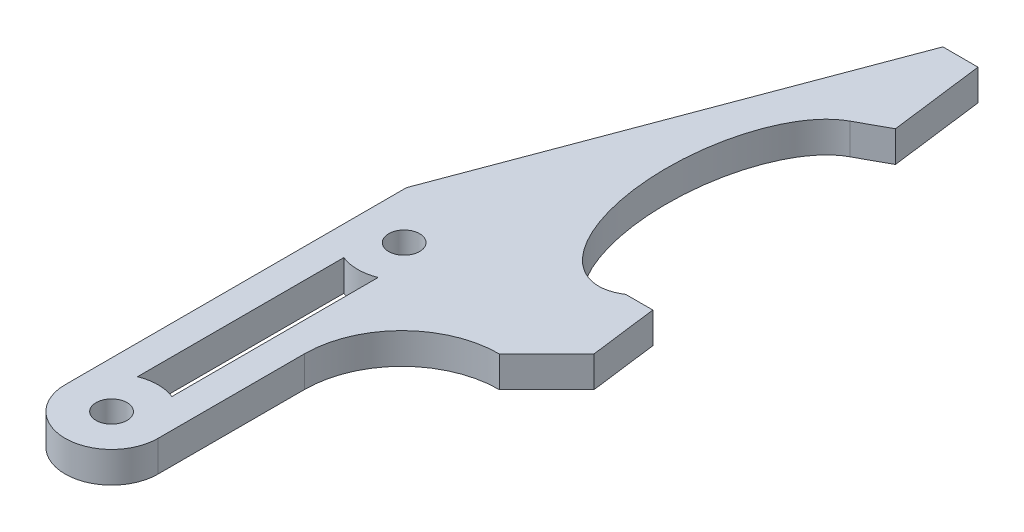
ISO-10303-21;
HEADER;
FILE_DESCRIPTION(('STEP AP214'),'2;1');
FILE_NAME('part.step','',(''),(''),'','','');
FILE_SCHEMA(('AUTOMOTIVE_DESIGN { 1 0 10303 214 1 1 1 1 }'));
ENDSEC;
DATA;
#1=APPLICATION_CONTEXT('core data for automotive mechanical design processes');
#2=APPLICATION_PROTOCOL_DEFINITION('international standard','automotive_design',2000,#1);
#3=PRODUCT_CONTEXT('',#1,'mechanical');
#4=PRODUCT('Part','Part','',(#3));
#5=PRODUCT_RELATED_PRODUCT_CATEGORY('part','',(#4));
#6=PRODUCT_DEFINITION_FORMATION('','',#4);
#7=PRODUCT_DEFINITION_CONTEXT('part definition',#1,'design');
#8=PRODUCT_DEFINITION('design','',#6,#7);
#9=PRODUCT_DEFINITION_SHAPE('','',#8);
#10=(LENGTH_UNIT() NAMED_UNIT(*) SI_UNIT(.MILLI.,.METRE.));
#11=(NAMED_UNIT(*) PLANE_ANGLE_UNIT() SI_UNIT($,.RADIAN.));
#12=(NAMED_UNIT(*) SI_UNIT($,.STERADIAN.) SOLID_ANGLE_UNIT());
#13=UNCERTAINTY_MEASURE_WITH_UNIT(LENGTH_MEASURE(1.E-05),#10,'distance_accuracy_value','');
#14=(GEOMETRIC_REPRESENTATION_CONTEXT(3) GLOBAL_UNCERTAINTY_ASSIGNED_CONTEXT((#13)) GLOBAL_UNIT_ASSIGNED_CONTEXT((#10,
#11,#12)) REPRESENTATION_CONTEXT('',''));
#15=CARTESIAN_POINT('',(0.,0.,0.));
#16=DIRECTION('',(0.,0.,1.));
#17=DIRECTION('',(1.,0.,0.));
#18=AXIS2_PLACEMENT_3D('',#15,#16,#17);
#19=CARTESIAN_POINT('',(12.5,0.,10.));
#20=DIRECTION('',(-0.991907308323476,0.,0.126964135465405));
#21=DIRECTION('',(0.126964135465405,0.,0.991907308323476));
#22=AXIS2_PLACEMENT_3D('',#19,#20,#21);
#23=PLANE('',#22);
#24=DIRECTION('',(0.126964135465405,0.,0.991907308323476));
#25=VECTOR('',#24,1.);
#26=CARTESIAN_POINT('',(12.5,0.,10.));
#27=LINE('',#26,#25);
#28=CARTESIAN_POINT('',(10.9945313979645,0.,-1.76147345340224));
#29=VERTEX_POINT('',#28);
#30=CARTESIAN_POINT('',(11.8787234042553,0.,5.14627659574474));
#31=VERTEX_POINT('',#30);
#32=EDGE_CURVE('E250',#29,#31,#27,.T.);
#33=ORIENTED_EDGE('',*,*,#32,.F.);
#34=DIRECTION('',(0.,1.,0.));
#35=VECTOR('',#34,1.);
#36=CARTESIAN_POINT('',(10.9945313979645,0.,-1.76147345340224));
#37=LINE('',#36,#35);
#38=CARTESIAN_POINT('',(10.9945313979645,3.175,-1.76147345340224));
#39=VERTEX_POINT('',#38);
#40=EDGE_CURVE('E152',#29,#39,#37,.T.);
#41=ORIENTED_EDGE('',*,*,#40,.T.);
#42=DIRECTION('',(0.126964135465405,0.,0.991907308323476));
#43=VECTOR('',#42,1.);
#44=CARTESIAN_POINT('',(12.5,3.175,10.));
#45=LINE('',#44,#43);
#46=CARTESIAN_POINT('',(11.8787234042553,3.175,5.14627659574474));
#47=VERTEX_POINT('',#46);
#48=EDGE_CURVE('E167',#39,#47,#45,.T.);
#49=ORIENTED_EDGE('',*,*,#48,.T.);
#50=DIRECTION('',(0.,1.,0.));
#51=VECTOR('',#50,1.);
#52=CARTESIAN_POINT('',(11.8787234042553,-6.825,5.14627659574474));
#53=LINE('',#52,#51);
#54=EDGE_CURVE('E252',#31,#47,#53,.T.);
#55=ORIENTED_EDGE('',*,*,#54,.F.);
#56=EDGE_LOOP('',(#33,#41,#49,#55));
#57=FACE_BOUND('',#56,.T.);
#58=ADVANCED_FACE('F35',(#57),#23,.F.);
#59=CARTESIAN_POINT('',(7.025,3.175,20.));
#60=DIRECTION('',(0.,-1.,0.));
#61=DIRECTION('',(0.,0.,-1.));
#62=AXIS2_PLACEMENT_3D('',#59,#60,#61);
#63=PLANE('',#62);
#64=CARTESIAN_POINT('',(-7.7375,3.175,35.));
#65=DIRECTION('',(0.,1.,0.));
#66=DIRECTION('',(0.,0.,1.));
#67=AXIS2_PLACEMENT_3D('',#64,#65,#66);
#68=CIRCLE('',#67,4.7625);
#69=CARTESIAN_POINT('',(-5.97499999999999,3.175,30.5756356388742));
#70=VERTEX_POINT('',#69);
#71=CARTESIAN_POINT('',(-9.5,3.175,30.5756356388742));
#72=VERTEX_POINT('',#71);
#73=EDGE_CURVE('E469',#70,#72,#68,.T.);
#74=ORIENTED_EDGE('',*,*,#73,.T.);
#75=DIRECTION('',(0.,0.,1.));
#76=VECTOR('',#75,1.);
#77=CARTESIAN_POINT('',(-9.5,3.175,0.));
#78=LINE('',#77,#76);
#79=CARTESIAN_POINT('',(-9.5,3.175,9.42705531363683));
#80=VERTEX_POINT('',#79);
#81=EDGE_CURVE('E483',#80,#72,#78,.T.);
#82=ORIENTED_EDGE('',*,*,#81,.F.);
#83=CARTESIAN_POINT('',(-7.7375,3.175,5.00000000000001));
#84=DIRECTION('',(0.,1.,0.));
#85=DIRECTION('',(0.,0.,1.));
#86=AXIS2_PLACEMENT_3D('',#83,#84,#85);
#87=CIRCLE('',#86,4.76499999999999);
#88=CARTESIAN_POINT('',(-5.97500000000001,3.175,9.42705531363683));
#89=VERTEX_POINT('',#88);
#90=EDGE_CURVE('E480',#80,#89,#87,.T.);
#91=ORIENTED_EDGE('',*,*,#90,.T.);
#92=DIRECTION('',(0.,0.,1.));
#93=VECTOR('',#92,1.);
#94=CARTESIAN_POINT('',(-5.975,3.175,0.));
#95=LINE('',#94,#93);
#96=EDGE_CURVE('E472',#89,#70,#95,.T.);
#97=ORIENTED_EDGE('',*,*,#96,.T.);
#98=EDGE_LOOP('',(#74,#82,#91,#97));
#99=FACE_BOUND('',#98,.T.);
#100=CARTESIAN_POINT('',(-7.7375,3.175,5.00000000000001));
#101=DIRECTION('',(0.,1.,0.));
#102=DIRECTION('',(0.,0.,1.));
#103=AXIS2_PLACEMENT_3D('',#100,#101,#102);
#104=CIRCLE('',#103,1.5875);
#105=CARTESIAN_POINT('',(-7.7375,3.175,6.58750000000001));
#106=VERTEX_POINT('',#105);
#107=EDGE_CURVE('E273',#106,#106,#104,.T.);
#108=ORIENTED_EDGE('',*,*,#107,.F.);
#109=EDGE_LOOP('',(#108));
#110=FACE_BOUND('',#109,.T.);
#111=CARTESIAN_POINT('',(-7.7375,3.175,35.));
#112=DIRECTION('',(0.,1.,0.));
#113=DIRECTION('',(0.,0.,1.));
#114=AXIS2_PLACEMENT_3D('',#111,#112,#113);
#115=CIRCLE('',#114,1.5875);
#116=CARTESIAN_POINT('',(-7.7375,3.175,36.5875));
#117=VERTEX_POINT('',#116);
#118=EDGE_CURVE('E267',#117,#117,#115,.T.);
#119=ORIENTED_EDGE('',*,*,#118,.F.);
#120=EDGE_LOOP('',(#119));
#121=FACE_BOUND('',#120,.T.);
#122=CARTESIAN_POINT('',(6.09633634533938,3.175,-15.0992522479477));
#123=DIRECTION('',(0.,1.,0.));
#124=DIRECTION('',(0.,0.,-1.));
#125=AXIS2_PLACEMENT_3D('',#122,#123,#124);
#126=ELLIPSE('',#125,14.,7.);
#127=CARTESIAN_POINT('',(4.32986705230956,3.175,-28.6461465395236));
#128=VERTEX_POINT('',#127);
#129=CARTESIAN_POINT('',(8.22375595767332,3.175,-1.76147345340224));
#130=VERTEX_POINT('',#129);
#131=EDGE_CURVE('E144',#128,#130,#126,.T.);
#132=ORIENTED_EDGE('',*,*,#131,.F.);
#133=DIRECTION('',(0.877309526004927,0.,-0.479924989535876));
#134=VECTOR('',#133,1.);
#135=CARTESIAN_POINT('',(7.34235478092335,3.175,-30.2941032740363));
#136=LINE('',#135,#134);
#137=CARTESIAN_POINT('',(7.34235478092335,3.175,-30.2941032740363));
#138=VERTEX_POINT('',#137);
#139=EDGE_CURVE('E11',#128,#138,#136,.T.);
#140=ORIENTED_EDGE('',*,*,#139,.T.);
#141=CARTESIAN_POINT('',(6.09999999999999,3.175,-40.));
#142=VERTEX_POINT('',#141);
#143=EDGE_CURVE('E256',#142,#138,#45,.T.);
#144=ORIENTED_EDGE('',*,*,#143,.F.);
#145=DIRECTION('',(-1.,0.,0.));
#146=VECTOR('',#145,1.);
#147=CARTESIAN_POINT('',(12.5,3.175,-40.));
#148=LINE('',#147,#146);
#149=CARTESIAN_POINT('',(2.49999999999999,3.175,-40.));
#150=VERTEX_POINT('',#149);
#151=EDGE_CURVE('E285',#142,#150,#148,.T.);
#152=ORIENTED_EDGE('',*,*,#151,.T.);
#153=DIRECTION('',(-0.351123441588392,0.,0.936329177569045));
#154=VECTOR('',#153,1.);
#155=CARTESIAN_POINT('',(2.49999999999999,3.175,-40.));
#156=LINE('',#155,#154);
#157=CARTESIAN_POINT('',(-12.5,3.175,0.));
#158=VERTEX_POINT('',#157);
#159=EDGE_CURVE('E287',#150,#158,#156,.T.);
#160=ORIENTED_EDGE('',*,*,#159,.T.);
#161=DIRECTION('',(0.,0.,1.));
#162=VECTOR('',#161,1.);
#163=CARTESIAN_POINT('',(-12.5,3.175,0.));
#164=LINE('',#163,#162);
#165=CARTESIAN_POINT('',(-12.5,3.175,35.));
#166=VERTEX_POINT('',#165);
#167=EDGE_CURVE('E289',#158,#166,#164,.T.);
#168=ORIENTED_EDGE('',*,*,#167,.T.);
#169=CARTESIAN_POINT('',(-7.7375,3.175,35.));
#170=DIRECTION('',(0.,1.,0.));
#171=DIRECTION('',(0.,0.,1.));
#172=AXIS2_PLACEMENT_3D('',#169,#170,#171);
#173=CIRCLE('',#172,4.76250000000001);
#174=CARTESIAN_POINT('',(-2.975,3.175,35.));
#175=VERTEX_POINT('',#174);
#176=EDGE_CURVE('E463',#166,#175,#173,.T.);
#177=ORIENTED_EDGE('',*,*,#176,.T.);
#178=DIRECTION('',(0.,0.,-1.));
#179=VECTOR('',#178,1.);
#180=CARTESIAN_POINT('',(-2.975,3.175,40.));
#181=LINE('',#180,#179);
#182=CARTESIAN_POINT('',(-2.975,3.175,20.));
#183=VERTEX_POINT('',#182);
#184=EDGE_CURVE('E279',#175,#183,#181,.T.);
#185=ORIENTED_EDGE('',*,*,#184,.T.);
#186=CARTESIAN_POINT('',(7.025,3.175,20.));
#187=DIRECTION('',(0.,-1.,0.));
#188=DIRECTION('',(0.,0.,-1.));
#189=AXIS2_PLACEMENT_3D('',#186,#187,#188);
#190=CIRCLE('',#189,10.);
#191=CARTESIAN_POINT('',(7.025,3.175,10.));
#192=VERTEX_POINT('',#191);
#193=EDGE_CURVE('E281',#183,#192,#190,.T.);
#194=ORIENTED_EDGE('',*,*,#193,.T.);
#195=DIRECTION('',(-0.707106781186551,0.,0.707106781186544));
#196=VECTOR('',#195,1.);
#197=CARTESIAN_POINT('',(7.025,3.175,10.));
#198=LINE('',#197,#196);
#199=EDGE_CURVE('E173',#47,#192,#198,.T.);
#200=ORIENTED_EDGE('',*,*,#199,.F.);
#201=ORIENTED_EDGE('',*,*,#48,.F.);
#202=DIRECTION('',(1.,0.,0.));
#203=VECTOR('',#202,1.);
#204=CARTESIAN_POINT('',(8.07701344455447,3.175,-1.76147345340224));
#205=LINE('',#204,#203);
#206=EDGE_CURVE('E157',#130,#39,#205,.T.);
#207=ORIENTED_EDGE('',*,*,#206,.F.);
#208=EDGE_LOOP('',(#132,#140,#144,#152,#160,#168,#177,#185,#194,#200,#201,#207));
#209=FACE_BOUND('',#208,.T.);
#210=ADVANCED_FACE('F165',(#99,#110,#121,#209),#63,.F.);
#211=CARTESIAN_POINT('',(7.025,0.,20.));
#212=DIRECTION('',(0.,-1.,0.));
#213=DIRECTION('',(0.,0.,-1.));
#214=AXIS2_PLACEMENT_3D('',#211,#212,#213);
#215=PLANE('',#214);
#216=CARTESIAN_POINT('',(6.09999999999999,0.,-40.));
#217=VERTEX_POINT('',#216);
#218=CARTESIAN_POINT('',(7.34235478092335,0.,-30.2941032740363));
#219=VERTEX_POINT('',#218);
#220=EDGE_CURVE('E255',#217,#219,#27,.T.);
#221=ORIENTED_EDGE('',*,*,#220,.T.);
#222=DIRECTION('',(-0.877309526004927,0.,0.479924989535876));
#223=VECTOR('',#222,1.);
#224=CARTESIAN_POINT('',(-14.0778726195254,0.,-18.5763433429094));
#225=LINE('',#224,#223);
#226=CARTESIAN_POINT('',(4.32986705230956,0.,-28.6461465395236));
#227=VERTEX_POINT('',#226);
#228=EDGE_CURVE('E57',#219,#227,#225,.T.);
#229=ORIENTED_EDGE('',*,*,#228,.T.);
#230=CARTESIAN_POINT('',(6.09633634533938,0.,-15.0992522479477));
#231=DIRECTION('',(0.,1.,0.));
#232=DIRECTION('',(0.,0.,-1.));
#233=AXIS2_PLACEMENT_3D('',#230,#231,#232);
#234=ELLIPSE('',#233,14.,7.);
#235=CARTESIAN_POINT('',(8.22375595767332,0.,-1.76147345340224));
#236=VERTEX_POINT('',#235);
#237=EDGE_CURVE('E151',#227,#236,#234,.T.);
#238=ORIENTED_EDGE('',*,*,#237,.T.);
#239=DIRECTION('',(1.,0.,0.));
#240=VECTOR('',#239,1.);
#241=CARTESIAN_POINT('',(8.07701344455447,0.,-1.76147345340224));
#242=LINE('',#241,#240);
#243=EDGE_CURVE('E160',#236,#29,#242,.T.);
#244=ORIENTED_EDGE('',*,*,#243,.T.);
#245=ORIENTED_EDGE('',*,*,#32,.T.);
#246=DIRECTION('',(0.707106781186551,0.,-0.707106781186544));
#247=VECTOR('',#246,1.);
#248=CARTESIAN_POINT('',(2.025,0.,15.));
#249=LINE('',#248,#247);
#250=CARTESIAN_POINT('',(7.025,0.,10.));
#251=VERTEX_POINT('',#250);
#252=EDGE_CURVE('E509',#251,#31,#249,.T.);
#253=ORIENTED_EDGE('',*,*,#252,.F.);
#254=CARTESIAN_POINT('',(7.025,0.,20.));
#255=DIRECTION('',(0.,-1.,0.));
#256=DIRECTION('',(0.,0.,-1.));
#257=AXIS2_PLACEMENT_3D('',#254,#255,#256);
#258=CIRCLE('',#257,10.);
#259=CARTESIAN_POINT('',(-2.975,0.,20.));
#260=VERTEX_POINT('',#259);
#261=EDGE_CURVE('E294',#260,#251,#258,.T.);
#262=ORIENTED_EDGE('',*,*,#261,.F.);
#263=DIRECTION('',(0.,0.,-1.));
#264=VECTOR('',#263,1.);
#265=CARTESIAN_POINT('',(-2.975,0.,40.));
#266=LINE('',#265,#264);
#267=CARTESIAN_POINT('',(-2.975,0.,35.));
#268=VERTEX_POINT('',#267);
#269=EDGE_CURVE('E276',#268,#260,#266,.T.);
#270=ORIENTED_EDGE('',*,*,#269,.F.);
#271=CARTESIAN_POINT('',(-7.7375,0.,35.));
#272=DIRECTION('',(0.,-1.,0.));
#273=DIRECTION('',(0.,0.,-1.));
#274=AXIS2_PLACEMENT_3D('',#271,#272,#273);
#275=CIRCLE('',#274,4.76250000000001);
#276=CARTESIAN_POINT('',(-12.5,0.,35.));
#277=VERTEX_POINT('',#276);
#278=EDGE_CURVE('E466',#268,#277,#275,.T.);
#279=ORIENTED_EDGE('',*,*,#278,.T.);
#280=DIRECTION('',(0.,0.,1.));
#281=VECTOR('',#280,1.);
#282=CARTESIAN_POINT('',(-12.5,0.,0.));
#283=LINE('',#282,#281);
#284=CARTESIAN_POINT('',(-12.5,0.,0.));
#285=VERTEX_POINT('',#284);
#286=EDGE_CURVE('E282',#285,#277,#283,.T.);
#287=ORIENTED_EDGE('',*,*,#286,.F.);
#288=DIRECTION('',(-0.351123441588392,0.,0.936329177569045));
#289=VECTOR('',#288,1.);
#290=CARTESIAN_POINT('',(2.49999999999999,0.,-40.));
#291=LINE('',#290,#289);
#292=CARTESIAN_POINT('',(2.49999999999999,0.,-40.));
#293=VERTEX_POINT('',#292);
#294=EDGE_CURVE('E299',#293,#285,#291,.T.);
#295=ORIENTED_EDGE('',*,*,#294,.F.);
#296=DIRECTION('',(-1.,0.,0.));
#297=VECTOR('',#296,1.);
#298=CARTESIAN_POINT('',(12.5,0.,-40.));
#299=LINE('',#298,#297);
#300=EDGE_CURVE('E297',#217,#293,#299,.T.);
#301=ORIENTED_EDGE('',*,*,#300,.F.);
#302=EDGE_LOOP('',(#221,#229,#238,#244,#245,#253,#262,#270,#279,#287,#295,#301));
#303=FACE_BOUND('',#302,.T.);
#304=DIRECTION('',(0.,0.,-1.));
#305=VECTOR('',#304,1.);
#306=CARTESIAN_POINT('',(-9.5,0.,20.));
#307=LINE('',#306,#305);
#308=CARTESIAN_POINT('',(-9.5,0.,30.5756356388742));
#309=VERTEX_POINT('',#308);
#310=CARTESIAN_POINT('',(-9.5,0.,9.42705531363683));
#311=VERTEX_POINT('',#310);
#312=EDGE_CURVE('E319',#309,#311,#307,.T.);
#313=ORIENTED_EDGE('',*,*,#312,.F.);
#314=CARTESIAN_POINT('',(-7.7375,0.,35.));
#315=DIRECTION('',(0.,-1.,0.));
#316=DIRECTION('',(0.,0.,-1.));
#317=AXIS2_PLACEMENT_3D('',#314,#315,#316);
#318=CIRCLE('',#317,4.7625);
#319=CARTESIAN_POINT('',(-5.97499999999999,0.,30.5756356388742));
#320=VERTEX_POINT('',#319);
#321=EDGE_CURVE('E321',#309,#320,#318,.T.);
#322=ORIENTED_EDGE('',*,*,#321,.T.);
#323=DIRECTION('',(0.,0.,-1.));
#324=VECTOR('',#323,1.);
#325=CARTESIAN_POINT('',(-5.97499999999999,0.,20.));
#326=LINE('',#325,#324);
#327=CARTESIAN_POINT('',(-5.975,0.,9.42705531363683));
#328=VERTEX_POINT('',#327);
#329=EDGE_CURVE('E313',#320,#328,#326,.T.);
#330=ORIENTED_EDGE('',*,*,#329,.T.);
#331=CARTESIAN_POINT('',(-7.7375,0.,5.00000000000001));
#332=DIRECTION('',(0.,-1.,0.));
#333=DIRECTION('',(0.,0.,-1.));
#334=AXIS2_PLACEMENT_3D('',#331,#332,#333);
#335=CIRCLE('',#334,4.76499999999999);
#336=EDGE_CURVE('E316',#328,#311,#335,.T.);
#337=ORIENTED_EDGE('',*,*,#336,.T.);
#338=EDGE_LOOP('',(#313,#322,#330,#337));
#339=FACE_BOUND('',#338,.T.);
#340=CARTESIAN_POINT('',(-7.7375,0.,5.00000000000001));
#341=DIRECTION('',(0.,1.,0.));
#342=DIRECTION('',(0.,0.,1.));
#343=AXIS2_PLACEMENT_3D('',#340,#341,#342);
#344=CIRCLE('',#343,1.5875);
#345=CARTESIAN_POINT('',(-7.7375,0.,6.58750000000001));
#346=VERTEX_POINT('',#345);
#347=EDGE_CURVE('E270',#346,#346,#344,.T.);
#348=ORIENTED_EDGE('',*,*,#347,.T.);
#349=EDGE_LOOP('',(#348));
#350=FACE_BOUND('',#349,.T.);
#351=CARTESIAN_POINT('',(-7.7375,0.,35.));
#352=DIRECTION('',(0.,1.,0.));
#353=DIRECTION('',(0.,0.,1.));
#354=AXIS2_PLACEMENT_3D('',#351,#352,#353);
#355=CIRCLE('',#354,1.5875);
#356=CARTESIAN_POINT('',(-7.7375,0.,36.5875));
#357=VERTEX_POINT('',#356);
#358=EDGE_CURVE('E266',#357,#357,#355,.T.);
#359=ORIENTED_EDGE('',*,*,#358,.T.);
#360=EDGE_LOOP('',(#359));
#361=FACE_BOUND('',#360,.T.);
#362=ADVANCED_FACE('F218',(#303,#339,#350,#361),#215,.T.);
#363=CARTESIAN_POINT('',(-2.975,3.175,40.));
#364=DIRECTION('',(-1.,0.,0.));
#365=DIRECTION('',(0.,0.,1.));
#366=AXIS2_PLACEMENT_3D('',#363,#364,#365);
#367=PLANE('',#366);
#368=DIRECTION('',(0.,1.,0.));
#369=VECTOR('',#368,1.);
#370=CARTESIAN_POINT('',(-2.975,-6.825,35.));
#371=LINE('',#370,#369);
#372=EDGE_CURVE('E474',#268,#175,#371,.T.);
#373=ORIENTED_EDGE('',*,*,#372,.F.);
#374=ORIENTED_EDGE('',*,*,#269,.T.);
#375=DIRECTION('',(0.,-1.,0.));
#376=VECTOR('',#375,1.);
#377=CARTESIAN_POINT('',(-2.975,3.175,20.));
#378=LINE('',#377,#376);
#379=EDGE_CURVE('E310',#183,#260,#378,.T.);
#380=ORIENTED_EDGE('',*,*,#379,.F.);
#381=ORIENTED_EDGE('',*,*,#184,.F.);
#382=EDGE_LOOP('',(#373,#374,#380,#381));
#383=FACE_BOUND('',#382,.T.);
#384=ADVANCED_FACE('F222',(#383),#367,.F.);
#385=CARTESIAN_POINT('',(7.025,3.175,20.));
#386=DIRECTION('',(0.,-1.,0.));
#387=DIRECTION('',(0.,0.,-1.));
#388=AXIS2_PLACEMENT_3D('',#385,#386,#387);
#389=CYLINDRICAL_SURFACE('',#388,10.);
#390=ORIENTED_EDGE('',*,*,#261,.T.);
#391=DIRECTION('',(0.,-1.,0.));
#392=VECTOR('',#391,1.);
#393=CARTESIAN_POINT('',(7.025,3.175,10.));
#394=LINE('',#393,#392);
#395=EDGE_CURVE('E308',#192,#251,#394,.T.);
#396=ORIENTED_EDGE('',*,*,#395,.F.);
#397=ORIENTED_EDGE('',*,*,#193,.F.);
#398=ORIENTED_EDGE('',*,*,#379,.T.);
#399=EDGE_LOOP('',(#390,#396,#397,#398));
#400=FACE_BOUND('',#399,.T.);
#401=ADVANCED_FACE('F233',(#400),#389,.F.);
#402=CARTESIAN_POINT('',(12.5,3.175,-40.));
#403=DIRECTION('',(0.,0.,1.));
#404=DIRECTION('',(1.,0.,0.));
#405=AXIS2_PLACEMENT_3D('',#402,#403,#404);
#406=PLANE('',#405);
#407=ORIENTED_EDGE('',*,*,#151,.F.);
#408=DIRECTION('',(0.,1.,0.));
#409=VECTOR('',#408,1.);
#410=CARTESIAN_POINT('',(6.09999999999999,0.,-40.));
#411=LINE('',#410,#409);
#412=EDGE_CURVE('E258',#217,#142,#411,.T.);
#413=ORIENTED_EDGE('',*,*,#412,.F.);
#414=ORIENTED_EDGE('',*,*,#300,.T.);
#415=DIRECTION('',(0.,-1.,0.));
#416=VECTOR('',#415,1.);
#417=CARTESIAN_POINT('',(2.49999999999999,3.175,-40.));
#418=LINE('',#417,#416);
#419=EDGE_CURVE('E305',#150,#293,#418,.T.);
#420=ORIENTED_EDGE('',*,*,#419,.F.);
#421=EDGE_LOOP('',(#407,#413,#414,#420));
#422=FACE_BOUND('',#421,.T.);
#423=ADVANCED_FACE('F229',(#422),#406,.F.);
#424=CARTESIAN_POINT('',(2.49999999999999,3.175,-40.));
#425=DIRECTION('',(0.936329177569044,0.,0.351123441588392));
#426=DIRECTION('',(0.351123441588392,0.,-0.936329177569045));
#427=AXIS2_PLACEMENT_3D('',#424,#425,#426);
#428=PLANE('',#427);
#429=ORIENTED_EDGE('',*,*,#294,.T.);
#430=DIRECTION('',(0.,-1.,0.));
#431=VECTOR('',#430,1.);
#432=CARTESIAN_POINT('',(-12.5,3.175,0.));
#433=LINE('',#432,#431);
#434=EDGE_CURVE('E292',#158,#285,#433,.T.);
#435=ORIENTED_EDGE('',*,*,#434,.F.);
#436=ORIENTED_EDGE('',*,*,#159,.F.);
#437=ORIENTED_EDGE('',*,*,#419,.T.);
#438=EDGE_LOOP('',(#429,#435,#436,#437));
#439=FACE_BOUND('',#438,.T.);
#440=ADVANCED_FACE('F225',(#439),#428,.F.);
#441=CARTESIAN_POINT('',(-12.5,3.175,0.));
#442=DIRECTION('',(1.,0.,0.));
#443=DIRECTION('',(0.,0.,-1.));
#444=AXIS2_PLACEMENT_3D('',#441,#442,#443);
#445=PLANE('',#444);
#446=ORIENTED_EDGE('',*,*,#286,.T.);
#447=DIRECTION('',(0.,1.,0.));
#448=VECTOR('',#447,1.);
#449=CARTESIAN_POINT('',(-12.5,-6.825,35.));
#450=LINE('',#449,#448);
#451=EDGE_CURVE('E162',#277,#166,#450,.T.);
#452=ORIENTED_EDGE('',*,*,#451,.T.);
#453=ORIENTED_EDGE('',*,*,#167,.F.);
#454=ORIENTED_EDGE('',*,*,#434,.T.);
#455=EDGE_LOOP('',(#446,#452,#453,#454));
#456=FACE_BOUND('',#455,.T.);
#457=ADVANCED_FACE('F214',(#456),#445,.F.);
#458=CARTESIAN_POINT('',(-7.7375,3.175,5.00000000000001));
#459=DIRECTION('',(0.,-1.,0.));
#460=DIRECTION('',(0.,0.,-1.));
#461=AXIS2_PLACEMENT_3D('',#458,#459,#460);
#462=CYLINDRICAL_SURFACE('',#461,1.5875);
#463=ORIENTED_EDGE('',*,*,#107,.T.);
#464=EDGE_LOOP('',(#463));
#465=FACE_BOUND('',#464,.T.);
#466=ORIENTED_EDGE('',*,*,#347,.F.);
#467=EDGE_LOOP('',(#466));
#468=FACE_BOUND('',#467,.T.);
#469=ADVANCED_FACE('F210',(#465,#468),#462,.F.);
#470=CARTESIAN_POINT('',(-7.7375,3.175,35.));
#471=DIRECTION('',(0.,-1.,0.));
#472=DIRECTION('',(0.,0.,-1.));
#473=AXIS2_PLACEMENT_3D('',#470,#471,#472);
#474=CYLINDRICAL_SURFACE('',#473,1.5875);
#475=ORIENTED_EDGE('',*,*,#118,.T.);
#476=EDGE_LOOP('',(#475));
#477=FACE_BOUND('',#476,.T.);
#478=ORIENTED_EDGE('',*,*,#358,.F.);
#479=EDGE_LOOP('',(#478));
#480=FACE_BOUND('',#479,.T.);
#481=ADVANCED_FACE('F206',(#477,#480),#474,.F.);
#482=ORIENTED_EDGE('',*,*,#143,.T.);
#483=DIRECTION('',(0.,-1.,0.));
#484=VECTOR('',#483,1.);
#485=CARTESIAN_POINT('',(7.34235478092335,0.,-30.2941032740363));
#486=LINE('',#485,#484);
#487=EDGE_CURVE('E161',#138,#219,#486,.T.);
#488=ORIENTED_EDGE('',*,*,#487,.T.);
#489=ORIENTED_EDGE('',*,*,#220,.F.);
#490=ORIENTED_EDGE('',*,*,#412,.T.);
#491=EDGE_LOOP('',(#482,#488,#489,#490));
#492=FACE_BOUND('',#491,.T.);
#493=ADVANCED_FACE('F202',(#492),#23,.F.);
#494=CARTESIAN_POINT('',(-7.7375,-6.825,35.));
#495=DIRECTION('',(0.,1.,0.));
#496=DIRECTION('',(0.,0.,1.));
#497=AXIS2_PLACEMENT_3D('',#494,#495,#496);
#498=CYLINDRICAL_SURFACE('',#497,4.7625);
#499=DIRECTION('',(0.,1.,0.));
#500=VECTOR('',#499,1.);
#501=CARTESIAN_POINT('',(-9.5,-6.825,30.5756356388742));
#502=LINE('',#501,#500);
#503=EDGE_CURVE('E486',#309,#72,#502,.T.);
#504=ORIENTED_EDGE('',*,*,#503,.T.);
#505=ORIENTED_EDGE('',*,*,#73,.F.);
#506=DIRECTION('',(0.,1.,0.));
#507=VECTOR('',#506,1.);
#508=CARTESIAN_POINT('',(-5.97499999999999,-6.825,30.5756356388742));
#509=LINE('',#508,#507);
#510=EDGE_CURVE('E262',#320,#70,#509,.T.);
#511=ORIENTED_EDGE('',*,*,#510,.F.);
#512=ORIENTED_EDGE('',*,*,#321,.F.);
#513=EDGE_LOOP('',(#504,#505,#511,#512));
#514=FACE_BOUND('',#513,.T.);
#515=ADVANCED_FACE('F192',(#514),#498,.T.);
#516=CARTESIAN_POINT('',(-9.5,-6.825,0.));
#517=DIRECTION('',(-1.,0.,0.));
#518=DIRECTION('',(0.,0.,1.));
#519=AXIS2_PLACEMENT_3D('',#516,#517,#518);
#520=PLANE('',#519);
#521=ORIENTED_EDGE('',*,*,#312,.T.);
#522=DIRECTION('',(0.,1.,0.));
#523=VECTOR('',#522,1.);
#524=CARTESIAN_POINT('',(-9.5,-6.825,9.42705531363683));
#525=LINE('',#524,#523);
#526=EDGE_CURVE('E488',#311,#80,#525,.T.);
#527=ORIENTED_EDGE('',*,*,#526,.T.);
#528=ORIENTED_EDGE('',*,*,#81,.T.);
#529=ORIENTED_EDGE('',*,*,#503,.F.);
#530=EDGE_LOOP('',(#521,#527,#528,#529));
#531=FACE_BOUND('',#530,.T.);
#532=ADVANCED_FACE('F188',(#531),#520,.F.);
#533=CARTESIAN_POINT('',(-7.7375,-6.825,5.00000000000001));
#534=DIRECTION('',(0.,1.,0.));
#535=DIRECTION('',(0.,0.,1.));
#536=AXIS2_PLACEMENT_3D('',#533,#534,#535);
#537=CYLINDRICAL_SURFACE('',#536,4.76499999999999);
#538=DIRECTION('',(0.,1.,0.));
#539=VECTOR('',#538,1.);
#540=CARTESIAN_POINT('',(-5.97500000000001,-6.825,9.42705531363683));
#541=LINE('',#540,#539);
#542=EDGE_CURVE('E489',#328,#89,#541,.T.);
#543=ORIENTED_EDGE('',*,*,#542,.T.);
#544=ORIENTED_EDGE('',*,*,#90,.F.);
#545=ORIENTED_EDGE('',*,*,#526,.F.);
#546=ORIENTED_EDGE('',*,*,#336,.F.);
#547=EDGE_LOOP('',(#543,#544,#545,#546));
#548=FACE_BOUND('',#547,.T.);
#549=ADVANCED_FACE('F191',(#548),#537,.T.);
#550=CARTESIAN_POINT('',(-5.975,-6.825,0.));
#551=DIRECTION('',(-1.,0.,0.));
#552=DIRECTION('',(0.,0.,1.));
#553=AXIS2_PLACEMENT_3D('',#550,#551,#552);
#554=PLANE('',#553);
#555=ORIENTED_EDGE('',*,*,#510,.T.);
#556=ORIENTED_EDGE('',*,*,#96,.F.);
#557=ORIENTED_EDGE('',*,*,#542,.F.);
#558=ORIENTED_EDGE('',*,*,#329,.F.);
#559=EDGE_LOOP('',(#555,#556,#557,#558));
#560=FACE_BOUND('',#559,.T.);
#561=ADVANCED_FACE('F186',(#560),#554,.T.);
#562=CARTESIAN_POINT('',(-7.7375,-6.825,35.));
#563=DIRECTION('',(0.,1.,0.));
#564=DIRECTION('',(0.,0.,1.));
#565=AXIS2_PLACEMENT_3D('',#562,#563,#564);
#566=CYLINDRICAL_SURFACE('',#565,4.76250000000001);
#567=ORIENTED_EDGE('',*,*,#372,.T.);
#568=ORIENTED_EDGE('',*,*,#176,.F.);
#569=ORIENTED_EDGE('',*,*,#451,.F.);
#570=ORIENTED_EDGE('',*,*,#278,.F.);
#571=EDGE_LOOP('',(#567,#568,#569,#570));
#572=FACE_BOUND('',#571,.T.);
#573=ADVANCED_FACE('F182',(#572),#566,.T.);
#574=CARTESIAN_POINT('',(7.025,-6.825,10.));
#575=DIRECTION('',(-0.707106781186544,0.,-0.707106781186551));
#576=DIRECTION('',(-0.707106781186551,0.,0.707106781186544));
#577=AXIS2_PLACEMENT_3D('',#574,#575,#576);
#578=PLANE('',#577);
#579=ORIENTED_EDGE('',*,*,#252,.T.);
#580=ORIENTED_EDGE('',*,*,#54,.T.);
#581=ORIENTED_EDGE('',*,*,#199,.T.);
#582=ORIENTED_EDGE('',*,*,#395,.T.);
#583=EDGE_LOOP('',(#579,#580,#581,#582));
#584=FACE_BOUND('',#583,.T.);
#585=ADVANCED_FACE('F179',(#584),#578,.F.);
#586=DIRECTION('',(0.,1.,0.));
#587=VECTOR('',#586,1.);
#588=SURFACE_OF_LINEAR_EXTRUSION('',#234,#587);
#589=ORIENTED_EDGE('',*,*,#237,.F.);
#590=DIRECTION('',(0.,1.,0.));
#591=VECTOR('',#590,1.);
#592=CARTESIAN_POINT('',(4.32986705230956,0.,-28.6461465395236));
#593=LINE('',#592,#591);
#594=EDGE_CURVE('E43',#227,#128,#593,.T.);
#595=ORIENTED_EDGE('',*,*,#594,.T.);
#596=ORIENTED_EDGE('',*,*,#131,.T.);
#597=DIRECTION('',(0.,1.,0.));
#598=VECTOR('',#597,1.);
#599=CARTESIAN_POINT('',(8.22375595767331,0.,-1.76147345340224));
#600=LINE('',#599,#598);
#601=EDGE_CURVE('E147',#130,#236,#600,.F.);
#602=ORIENTED_EDGE('',*,*,#601,.T.);
#603=EDGE_LOOP('',(#589,#595,#596,#602));
#604=FACE_BOUND('',#603,.T.);
#605=ADVANCED_FACE('F146',(#604),#588,.F.);
#606=CARTESIAN_POINT('',(8.07701344455447,0.,-1.76147345340224));
#607=DIRECTION('',(0.,0.,1.));
#608=DIRECTION('',(1.,0.,0.));
#609=AXIS2_PLACEMENT_3D('',#606,#607,#608);
#610=PLANE('',#609);
#611=ORIENTED_EDGE('',*,*,#243,.F.);
#612=ORIENTED_EDGE('',*,*,#601,.F.);
#613=ORIENTED_EDGE('',*,*,#206,.T.);
#614=ORIENTED_EDGE('',*,*,#40,.F.);
#615=EDGE_LOOP('',(#611,#612,#613,#614));
#616=FACE_BOUND('',#615,.T.);
#617=ADVANCED_FACE('F156',(#616),#610,.F.);
#618=CARTESIAN_POINT('',(7.34235478092335,1.5875,-30.2941032740363));
#619=DIRECTION('',(0.479924989535876,0.,0.877309526004927));
#620=DIRECTION('',(0.,1.,0.));
#621=AXIS2_PLACEMENT_3D('',#618,#619,#620);
#622=PLANE('',#621);
#623=ORIENTED_EDGE('',*,*,#139,.F.);
#624=ORIENTED_EDGE('',*,*,#594,.F.);
#625=ORIENTED_EDGE('',*,*,#228,.F.);
#626=ORIENTED_EDGE('',*,*,#487,.F.);
#627=EDGE_LOOP('',(#623,#624,#625,#626));
#628=FACE_BOUND('',#627,.T.);
#629=ADVANCED_FACE('F37',(#628),#622,.T.);
#630=CLOSED_SHELL('',(#58,#210,#362,#384,#401,#423,#440,#457,#469,#481,#493,#515,#532,#549,#561,
#573,#585,#605,#617,#629));
#631=MANIFOLD_SOLID_BREP('B2',#630);
#632=ADVANCED_BREP_SHAPE_REPRESENTATION('',(#18,#631),#14);
#633=SHAPE_DEFINITION_REPRESENTATION(#9,#632);
ENDSEC;
END-ISO-10303-21;
